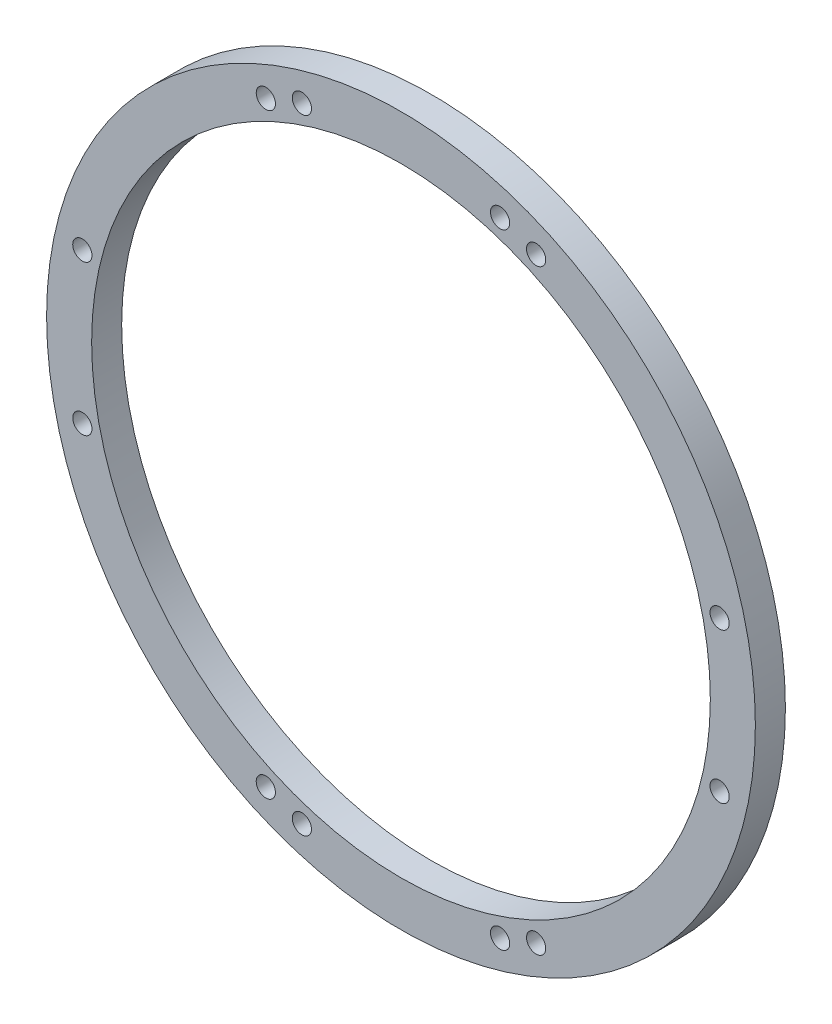
ISO-10303-21;
HEADER;
FILE_DESCRIPTION(('STEP AP214'),'2;1');
FILE_NAME('part.step','',(''),(''),'','','');
FILE_SCHEMA(('AUTOMOTIVE_DESIGN { 1 0 10303 214 1 1 1 1 }'));
ENDSEC;
DATA;
#1=APPLICATION_CONTEXT('core data for automotive mechanical design processes');
#2=APPLICATION_PROTOCOL_DEFINITION('international standard','automotive_design',2000,#1);
#3=PRODUCT_CONTEXT('',#1,'mechanical');
#4=PRODUCT('Part','Part','',(#3));
#5=PRODUCT_RELATED_PRODUCT_CATEGORY('part','',(#4));
#6=PRODUCT_DEFINITION_FORMATION('','',#4);
#7=PRODUCT_DEFINITION_CONTEXT('part definition',#1,'design');
#8=PRODUCT_DEFINITION('design','',#6,#7);
#9=PRODUCT_DEFINITION_SHAPE('','',#8);
#10=(LENGTH_UNIT() NAMED_UNIT(*) SI_UNIT(.MILLI.,.METRE.));
#11=(NAMED_UNIT(*) PLANE_ANGLE_UNIT() SI_UNIT($,.RADIAN.));
#12=(NAMED_UNIT(*) SI_UNIT($,.STERADIAN.) SOLID_ANGLE_UNIT());
#13=UNCERTAINTY_MEASURE_WITH_UNIT(LENGTH_MEASURE(1.E-05),#10,'distance_accuracy_value','');
#14=(GEOMETRIC_REPRESENTATION_CONTEXT(3) GLOBAL_UNCERTAINTY_ASSIGNED_CONTEXT((#13)) GLOBAL_UNIT_ASSIGNED_CONTEXT((#10,
#11,#12)) REPRESENTATION_CONTEXT('',''));
#15=CARTESIAN_POINT('',(0.,0.,0.));
#16=DIRECTION('',(0.,0.,1.));
#17=DIRECTION('',(1.,0.,0.));
#18=AXIS2_PLACEMENT_3D('',#15,#16,#17);
#19=CARTESIAN_POINT('',(0.,0.,5.));
#20=DIRECTION('',(0.,0.,1.));
#21=DIRECTION('',(1.,0.,0.));
#22=AXIS2_PLACEMENT_3D('',#19,#20,#21);
#23=PLANE('',#22);
#24=CARTESIAN_POINT('',(-22.5,49.6386945839634,5.));
#25=DIRECTION('',(0.,0.,1.));
#26=DIRECTION('',(-1.,0.,0.));
#27=AXIS2_PLACEMENT_3D('',#24,#25,#26);
#28=CIRCLE('',#27,1.6);
#29=CARTESIAN_POINT('',(-24.1,49.6386945839634,5.));
#30=VERTEX_POINT('',#29);
#31=EDGE_CURVE('E117',#30,#30,#28,.T.);
#32=ORIENTED_EDGE('',*,*,#31,.F.);
#33=EDGE_LOOP('',(#32));
#34=FACE_BOUND('',#33,.T.);
#35=CARTESIAN_POINT('',(-53.0471488394994,-12.5,5.));
#36=DIRECTION('',(0.,0.,1.));
#37=DIRECTION('',(1.,0.,0.));
#38=AXIS2_PLACEMENT_3D('',#35,#36,#37);
#39=CIRCLE('',#38,1.6);
#40=CARTESIAN_POINT('',(-51.4471488394994,-12.5,5.));
#41=VERTEX_POINT('',#40);
#42=EDGE_CURVE('E105',#41,#41,#39,.T.);
#43=ORIENTED_EDGE('',*,*,#42,.F.);
#44=EDGE_LOOP('',(#43));
#45=FACE_BOUND('',#44,.T.);
#46=CARTESIAN_POINT('',(-16.5,-51.9422756528822,5.));
#47=DIRECTION('',(0.,0.,1.));
#48=DIRECTION('',(1.,0.,0.));
#49=AXIS2_PLACEMENT_3D('',#46,#47,#48);
#50=CIRCLE('',#49,1.6);
#51=CARTESIAN_POINT('',(-14.9,-51.9422756528822,5.));
#52=VERTEX_POINT('',#51);
#53=EDGE_CURVE('E93',#52,#52,#50,.T.);
#54=ORIENTED_EDGE('',*,*,#53,.F.);
#55=EDGE_LOOP('',(#54));
#56=FACE_BOUND('',#55,.T.);
#57=CARTESIAN_POINT('',(16.5,-51.9422756528822,5.));
#58=DIRECTION('',(0.,0.,1.));
#59=DIRECTION('',(-1.,0.,0.));
#60=AXIS2_PLACEMENT_3D('',#57,#58,#59);
#61=CIRCLE('',#60,1.6);
#62=CARTESIAN_POINT('',(14.9,-51.9422756528822,5.));
#63=VERTEX_POINT('',#62);
#64=EDGE_CURVE('E81',#63,#63,#61,.T.);
#65=ORIENTED_EDGE('',*,*,#64,.F.);
#66=EDGE_LOOP('',(#65));
#67=FACE_BOUND('',#66,.T.);
#68=CARTESIAN_POINT('',(53.0471488394994,12.5,5.));
#69=DIRECTION('',(0.,0.,1.));
#70=DIRECTION('',(1.,0.,0.));
#71=AXIS2_PLACEMENT_3D('',#68,#69,#70);
#72=CIRCLE('',#71,1.6);
#73=CARTESIAN_POINT('',(54.6471488394994,12.5,5.));
#74=VERTEX_POINT('',#73);
#75=EDGE_CURVE('E69',#74,#74,#72,.T.);
#76=ORIENTED_EDGE('',*,*,#75,.F.);
#77=EDGE_LOOP('',(#76));
#78=FACE_BOUND('',#77,.T.);
#79=CARTESIAN_POINT('',(16.5,51.9422756528822,5.));
#80=DIRECTION('',(0.,0.,1.));
#81=DIRECTION('',(1.,0.,0.));
#82=AXIS2_PLACEMENT_3D('',#79,#80,#81);
#83=CIRCLE('',#82,1.6);
#84=CARTESIAN_POINT('',(18.1,51.9422756528822,5.));
#85=VERTEX_POINT('',#84);
#86=EDGE_CURVE('E57',#85,#85,#83,.T.);
#87=ORIENTED_EDGE('',*,*,#86,.F.);
#88=EDGE_LOOP('',(#87));
#89=FACE_BOUND('',#88,.T.);
#90=CARTESIAN_POINT('',(0.,0.,5.));
#91=DIRECTION('',(0.,0.,1.));
#92=DIRECTION('',(1.,0.,0.));
#93=AXIS2_PLACEMENT_3D('',#90,#91,#92);
#94=CIRCLE('',#93,59.);
#95=CARTESIAN_POINT('',(59.,0.,5.));
#96=VERTEX_POINT('',#95);
#97=EDGE_CURVE('E10',#96,#96,#94,.T.);
#98=ORIENTED_EDGE('',*,*,#97,.T.);
#99=EDGE_LOOP('',(#98));
#100=FACE_BOUND('',#99,.T.);
#101=CARTESIAN_POINT('',(0.,0.,5.));
#102=DIRECTION('',(0.,0.,1.));
#103=DIRECTION('',(1.,0.,0.));
#104=AXIS2_PLACEMENT_3D('',#101,#102,#103);
#105=CIRCLE('',#104,51.5);
#106=CARTESIAN_POINT('',(51.5,0.,5.));
#107=VERTEX_POINT('',#106);
#108=EDGE_CURVE('E52',#107,#107,#105,.T.);
#109=ORIENTED_EDGE('',*,*,#108,.F.);
#110=EDGE_LOOP('',(#109));
#111=FACE_BOUND('',#110,.T.);
#112=CARTESIAN_POINT('',(22.5,49.6386945839634,5.));
#113=DIRECTION('',(0.,0.,1.));
#114=DIRECTION('',(1.,0.,0.));
#115=AXIS2_PLACEMENT_3D('',#112,#113,#114);
#116=CIRCLE('',#115,1.6);
#117=CARTESIAN_POINT('',(24.1,49.6386945839634,5.));
#118=VERTEX_POINT('',#117);
#119=EDGE_CURVE('E63',#118,#118,#116,.T.);
#120=ORIENTED_EDGE('',*,*,#119,.F.);
#121=EDGE_LOOP('',(#120));
#122=FACE_BOUND('',#121,.T.);
#123=CARTESIAN_POINT('',(22.5,-49.6386945839634,5.));
#124=DIRECTION('',(0.,0.,1.));
#125=DIRECTION('',(-1.,0.,0.));
#126=AXIS2_PLACEMENT_3D('',#123,#124,#125);
#127=CIRCLE('',#126,1.6);
#128=CARTESIAN_POINT('',(20.9,-49.6386945839634,5.));
#129=VERTEX_POINT('',#128);
#130=EDGE_CURVE('E75',#129,#129,#127,.T.);
#131=ORIENTED_EDGE('',*,*,#130,.F.);
#132=EDGE_LOOP('',(#131));
#133=FACE_BOUND('',#132,.T.);
#134=CARTESIAN_POINT('',(53.0471488394994,-12.5,5.));
#135=DIRECTION('',(0.,0.,1.));
#136=DIRECTION('',(-1.,0.,0.));
#137=AXIS2_PLACEMENT_3D('',#134,#135,#136);
#138=CIRCLE('',#137,1.6);
#139=CARTESIAN_POINT('',(51.4471488394994,-12.5,5.));
#140=VERTEX_POINT('',#139);
#141=EDGE_CURVE('E87',#140,#140,#138,.T.);
#142=ORIENTED_EDGE('',*,*,#141,.F.);
#143=EDGE_LOOP('',(#142));
#144=FACE_BOUND('',#143,.T.);
#145=CARTESIAN_POINT('',(-22.5,-49.6386945839634,5.));
#146=DIRECTION('',(0.,0.,1.));
#147=DIRECTION('',(1.,0.,0.));
#148=AXIS2_PLACEMENT_3D('',#145,#146,#147);
#149=CIRCLE('',#148,1.6);
#150=CARTESIAN_POINT('',(-20.9,-49.6386945839634,5.));
#151=VERTEX_POINT('',#150);
#152=EDGE_CURVE('E99',#151,#151,#149,.T.);
#153=ORIENTED_EDGE('',*,*,#152,.F.);
#154=EDGE_LOOP('',(#153));
#155=FACE_BOUND('',#154,.T.);
#156=CARTESIAN_POINT('',(-53.0471488394994,12.5,5.));
#157=DIRECTION('',(0.,0.,1.));
#158=DIRECTION('',(-1.,0.,0.));
#159=AXIS2_PLACEMENT_3D('',#156,#157,#158);
#160=CIRCLE('',#159,1.6);
#161=CARTESIAN_POINT('',(-54.6471488394994,12.5,5.));
#162=VERTEX_POINT('',#161);
#163=EDGE_CURVE('E111',#162,#162,#160,.T.);
#164=ORIENTED_EDGE('',*,*,#163,.F.);
#165=EDGE_LOOP('',(#164));
#166=FACE_BOUND('',#165,.T.);
#167=CARTESIAN_POINT('',(-16.5,51.9422756528822,5.));
#168=DIRECTION('',(0.,0.,1.));
#169=DIRECTION('',(-1.,0.,0.));
#170=AXIS2_PLACEMENT_3D('',#167,#168,#169);
#171=CIRCLE('',#170,1.6);
#172=CARTESIAN_POINT('',(-18.1,51.9422756528822,5.));
#173=VERTEX_POINT('',#172);
#174=EDGE_CURVE('E123',#173,#173,#171,.T.);
#175=ORIENTED_EDGE('',*,*,#174,.F.);
#176=EDGE_LOOP('',(#175));
#177=FACE_BOUND('',#176,.T.);
#178=ADVANCED_FACE('F41',(#34,#45,#56,#67,#78,#89,#100,#111,#122,#133,#144,#155,#166,#177),#23,.T.);
#179=CARTESIAN_POINT('',(0.,0.,0.));
#180=DIRECTION('',(0.,0.,1.));
#181=DIRECTION('',(1.,0.,0.));
#182=AXIS2_PLACEMENT_3D('',#179,#180,#181);
#183=PLANE('',#182);
#184=CARTESIAN_POINT('',(0.,0.,0.));
#185=DIRECTION('',(0.,0.,1.));
#186=DIRECTION('',(1.,0.,0.));
#187=AXIS2_PLACEMENT_3D('',#184,#185,#186);
#188=CIRCLE('',#187,59.);
#189=CARTESIAN_POINT('',(59.,0.,0.));
#190=VERTEX_POINT('',#189);
#191=EDGE_CURVE('E45',#190,#190,#188,.T.);
#192=ORIENTED_EDGE('',*,*,#191,.F.);
#193=EDGE_LOOP('',(#192));
#194=FACE_BOUND('',#193,.T.);
#195=CARTESIAN_POINT('',(0.,0.,0.));
#196=DIRECTION('',(0.,0.,1.));
#197=DIRECTION('',(1.,0.,0.));
#198=AXIS2_PLACEMENT_3D('',#195,#196,#197);
#199=CIRCLE('',#198,51.5);
#200=CARTESIAN_POINT('',(51.5,0.,0.));
#201=VERTEX_POINT('',#200);
#202=EDGE_CURVE('E54',#201,#201,#199,.T.);
#203=ORIENTED_EDGE('',*,*,#202,.T.);
#204=EDGE_LOOP('',(#203));
#205=FACE_BOUND('',#204,.T.);
#206=CARTESIAN_POINT('',(16.5,51.9422756528822,0.));
#207=DIRECTION('',(0.,0.,1.));
#208=DIRECTION('',(1.,0.,0.));
#209=AXIS2_PLACEMENT_3D('',#206,#207,#208);
#210=CIRCLE('',#209,1.6);
#211=CARTESIAN_POINT('',(18.1,51.9422756528822,0.));
#212=VERTEX_POINT('',#211);
#213=EDGE_CURVE('E60',#212,#212,#210,.T.);
#214=ORIENTED_EDGE('',*,*,#213,.T.);
#215=EDGE_LOOP('',(#214));
#216=FACE_BOUND('',#215,.T.);
#217=CARTESIAN_POINT('',(22.5,49.6386945839634,0.));
#218=DIRECTION('',(0.,0.,1.));
#219=DIRECTION('',(1.,0.,0.));
#220=AXIS2_PLACEMENT_3D('',#217,#218,#219);
#221=CIRCLE('',#220,1.6);
#222=CARTESIAN_POINT('',(24.1,49.6386945839634,0.));
#223=VERTEX_POINT('',#222);
#224=EDGE_CURVE('E66',#223,#223,#221,.T.);
#225=ORIENTED_EDGE('',*,*,#224,.T.);
#226=EDGE_LOOP('',(#225));
#227=FACE_BOUND('',#226,.T.);
#228=CARTESIAN_POINT('',(53.0471488394994,12.5,0.));
#229=DIRECTION('',(0.,0.,1.));
#230=DIRECTION('',(1.,0.,0.));
#231=AXIS2_PLACEMENT_3D('',#228,#229,#230);
#232=CIRCLE('',#231,1.6);
#233=CARTESIAN_POINT('',(54.6471488394994,12.5,0.));
#234=VERTEX_POINT('',#233);
#235=EDGE_CURVE('E72',#234,#234,#232,.T.);
#236=ORIENTED_EDGE('',*,*,#235,.T.);
#237=EDGE_LOOP('',(#236));
#238=FACE_BOUND('',#237,.T.);
#239=CARTESIAN_POINT('',(22.5,-49.6386945839634,0.));
#240=DIRECTION('',(0.,0.,1.));
#241=DIRECTION('',(-1.,0.,0.));
#242=AXIS2_PLACEMENT_3D('',#239,#240,#241);
#243=CIRCLE('',#242,1.6);
#244=CARTESIAN_POINT('',(20.9,-49.6386945839634,0.));
#245=VERTEX_POINT('',#244);
#246=EDGE_CURVE('E78',#245,#245,#243,.T.);
#247=ORIENTED_EDGE('',*,*,#246,.T.);
#248=EDGE_LOOP('',(#247));
#249=FACE_BOUND('',#248,.T.);
#250=CARTESIAN_POINT('',(16.5,-51.9422756528822,0.));
#251=DIRECTION('',(0.,0.,1.));
#252=DIRECTION('',(-1.,0.,0.));
#253=AXIS2_PLACEMENT_3D('',#250,#251,#252);
#254=CIRCLE('',#253,1.6);
#255=CARTESIAN_POINT('',(14.9,-51.9422756528822,0.));
#256=VERTEX_POINT('',#255);
#257=EDGE_CURVE('E84',#256,#256,#254,.T.);
#258=ORIENTED_EDGE('',*,*,#257,.T.);
#259=EDGE_LOOP('',(#258));
#260=FACE_BOUND('',#259,.T.);
#261=CARTESIAN_POINT('',(53.0471488394994,-12.5,0.));
#262=DIRECTION('',(0.,0.,1.));
#263=DIRECTION('',(-1.,0.,0.));
#264=AXIS2_PLACEMENT_3D('',#261,#262,#263);
#265=CIRCLE('',#264,1.6);
#266=CARTESIAN_POINT('',(51.4471488394994,-12.5,0.));
#267=VERTEX_POINT('',#266);
#268=EDGE_CURVE('E90',#267,#267,#265,.T.);
#269=ORIENTED_EDGE('',*,*,#268,.T.);
#270=EDGE_LOOP('',(#269));
#271=FACE_BOUND('',#270,.T.);
#272=CARTESIAN_POINT('',(-16.5,-51.9422756528822,0.));
#273=DIRECTION('',(0.,0.,1.));
#274=DIRECTION('',(1.,0.,0.));
#275=AXIS2_PLACEMENT_3D('',#272,#273,#274);
#276=CIRCLE('',#275,1.6);
#277=CARTESIAN_POINT('',(-14.9,-51.9422756528822,0.));
#278=VERTEX_POINT('',#277);
#279=EDGE_CURVE('E96',#278,#278,#276,.T.);
#280=ORIENTED_EDGE('',*,*,#279,.T.);
#281=EDGE_LOOP('',(#280));
#282=FACE_BOUND('',#281,.T.);
#283=CARTESIAN_POINT('',(-22.5,-49.6386945839634,0.));
#284=DIRECTION('',(0.,0.,1.));
#285=DIRECTION('',(1.,0.,0.));
#286=AXIS2_PLACEMENT_3D('',#283,#284,#285);
#287=CIRCLE('',#286,1.6);
#288=CARTESIAN_POINT('',(-20.9,-49.6386945839634,0.));
#289=VERTEX_POINT('',#288);
#290=EDGE_CURVE('E102',#289,#289,#287,.T.);
#291=ORIENTED_EDGE('',*,*,#290,.T.);
#292=EDGE_LOOP('',(#291));
#293=FACE_BOUND('',#292,.T.);
#294=CARTESIAN_POINT('',(-53.0471488394994,-12.5,0.));
#295=DIRECTION('',(0.,0.,1.));
#296=DIRECTION('',(1.,0.,0.));
#297=AXIS2_PLACEMENT_3D('',#294,#295,#296);
#298=CIRCLE('',#297,1.6);
#299=CARTESIAN_POINT('',(-51.4471488394994,-12.5,0.));
#300=VERTEX_POINT('',#299);
#301=EDGE_CURVE('E108',#300,#300,#298,.T.);
#302=ORIENTED_EDGE('',*,*,#301,.T.);
#303=EDGE_LOOP('',(#302));
#304=FACE_BOUND('',#303,.T.);
#305=CARTESIAN_POINT('',(-53.0471488394994,12.5,0.));
#306=DIRECTION('',(0.,0.,1.));
#307=DIRECTION('',(-1.,0.,0.));
#308=AXIS2_PLACEMENT_3D('',#305,#306,#307);
#309=CIRCLE('',#308,1.6);
#310=CARTESIAN_POINT('',(-54.6471488394994,12.5,0.));
#311=VERTEX_POINT('',#310);
#312=EDGE_CURVE('E114',#311,#311,#309,.T.);
#313=ORIENTED_EDGE('',*,*,#312,.T.);
#314=EDGE_LOOP('',(#313));
#315=FACE_BOUND('',#314,.T.);
#316=CARTESIAN_POINT('',(-22.5,49.6386945839634,0.));
#317=DIRECTION('',(0.,0.,1.));
#318=DIRECTION('',(-1.,0.,0.));
#319=AXIS2_PLACEMENT_3D('',#316,#317,#318);
#320=CIRCLE('',#319,1.6);
#321=CARTESIAN_POINT('',(-24.1,49.6386945839634,0.));
#322=VERTEX_POINT('',#321);
#323=EDGE_CURVE('E120',#322,#322,#320,.T.);
#324=ORIENTED_EDGE('',*,*,#323,.T.);
#325=EDGE_LOOP('',(#324));
#326=FACE_BOUND('',#325,.T.);
#327=CARTESIAN_POINT('',(-16.5,51.9422756528822,0.));
#328=DIRECTION('',(0.,0.,1.));
#329=DIRECTION('',(-1.,0.,0.));
#330=AXIS2_PLACEMENT_3D('',#327,#328,#329);
#331=CIRCLE('',#330,1.6);
#332=CARTESIAN_POINT('',(-18.1,51.9422756528822,0.));
#333=VERTEX_POINT('',#332);
#334=EDGE_CURVE('E126',#333,#333,#331,.T.);
#335=ORIENTED_EDGE('',*,*,#334,.T.);
#336=EDGE_LOOP('',(#335));
#337=FACE_BOUND('',#336,.T.);
#338=ADVANCED_FACE('F136',(#194,#205,#216,#227,#238,#249,#260,#271,#282,#293,#304,#315,#326,
#337),#183,.F.);
#339=CARTESIAN_POINT('',(0.,0.,5.));
#340=DIRECTION('',(0.,0.,-1.));
#341=DIRECTION('',(-1.,0.,0.));
#342=AXIS2_PLACEMENT_3D('',#339,#340,#341);
#343=CYLINDRICAL_SURFACE('',#342,59.);
#344=ORIENTED_EDGE('',*,*,#97,.F.);
#345=EDGE_LOOP('',(#344));
#346=FACE_BOUND('',#345,.T.);
#347=ORIENTED_EDGE('',*,*,#191,.T.);
#348=EDGE_LOOP('',(#347));
#349=FACE_BOUND('',#348,.T.);
#350=ADVANCED_FACE('F43',(#346,#349),#343,.T.);
#351=CARTESIAN_POINT('',(0.,0.,5.));
#352=DIRECTION('',(0.,0.,-1.));
#353=DIRECTION('',(-1.,0.,0.));
#354=AXIS2_PLACEMENT_3D('',#351,#352,#353);
#355=CYLINDRICAL_SURFACE('',#354,51.5);
#356=ORIENTED_EDGE('',*,*,#108,.T.);
#357=EDGE_LOOP('',(#356));
#358=FACE_BOUND('',#357,.T.);
#359=ORIENTED_EDGE('',*,*,#202,.F.);
#360=EDGE_LOOP('',(#359));
#361=FACE_BOUND('',#360,.T.);
#362=ADVANCED_FACE('F146',(#358,#361),#355,.F.);
#363=CARTESIAN_POINT('',(16.5,51.9422756528822,5.));
#364=DIRECTION('',(0.,0.,-1.));
#365=DIRECTION('',(-1.,0.,0.));
#366=AXIS2_PLACEMENT_3D('',#363,#364,#365);
#367=CYLINDRICAL_SURFACE('',#366,1.6);
#368=ORIENTED_EDGE('',*,*,#86,.T.);
#369=EDGE_LOOP('',(#368));
#370=FACE_BOUND('',#369,.T.);
#371=ORIENTED_EDGE('',*,*,#213,.F.);
#372=EDGE_LOOP('',(#371));
#373=FACE_BOUND('',#372,.T.);
#374=ADVANCED_FACE('F149',(#370,#373),#367,.F.);
#375=CARTESIAN_POINT('',(22.5,49.6386945839634,5.));
#376=DIRECTION('',(0.,0.,-1.));
#377=DIRECTION('',(-1.,0.,0.));
#378=AXIS2_PLACEMENT_3D('',#375,#376,#377);
#379=CYLINDRICAL_SURFACE('',#378,1.6);
#380=ORIENTED_EDGE('',*,*,#119,.T.);
#381=EDGE_LOOP('',(#380));
#382=FACE_BOUND('',#381,.T.);
#383=ORIENTED_EDGE('',*,*,#224,.F.);
#384=EDGE_LOOP('',(#383));
#385=FACE_BOUND('',#384,.T.);
#386=ADVANCED_FACE('F153',(#382,#385),#379,.F.);
#387=CARTESIAN_POINT('',(53.0471488394994,12.5,5.));
#388=DIRECTION('',(0.,0.,-1.));
#389=DIRECTION('',(-1.,0.,0.));
#390=AXIS2_PLACEMENT_3D('',#387,#388,#389);
#391=CYLINDRICAL_SURFACE('',#390,1.6);
#392=ORIENTED_EDGE('',*,*,#75,.T.);
#393=EDGE_LOOP('',(#392));
#394=FACE_BOUND('',#393,.T.);
#395=ORIENTED_EDGE('',*,*,#235,.F.);
#396=EDGE_LOOP('',(#395));
#397=FACE_BOUND('',#396,.T.);
#398=ADVANCED_FACE('F157',(#394,#397),#391,.F.);
#399=CARTESIAN_POINT('',(22.5,-49.6386945839634,5.));
#400=DIRECTION('',(0.,0.,-1.));
#401=DIRECTION('',(-1.,0.,0.));
#402=AXIS2_PLACEMENT_3D('',#399,#400,#401);
#403=CYLINDRICAL_SURFACE('',#402,1.6);
#404=ORIENTED_EDGE('',*,*,#130,.T.);
#405=EDGE_LOOP('',(#404));
#406=FACE_BOUND('',#405,.T.);
#407=ORIENTED_EDGE('',*,*,#246,.F.);
#408=EDGE_LOOP('',(#407));
#409=FACE_BOUND('',#408,.T.);
#410=ADVANCED_FACE('F161',(#406,#409),#403,.F.);
#411=CARTESIAN_POINT('',(16.5,-51.9422756528822,5.));
#412=DIRECTION('',(0.,0.,-1.));
#413=DIRECTION('',(-1.,0.,0.));
#414=AXIS2_PLACEMENT_3D('',#411,#412,#413);
#415=CYLINDRICAL_SURFACE('',#414,1.6);
#416=ORIENTED_EDGE('',*,*,#64,.T.);
#417=EDGE_LOOP('',(#416));
#418=FACE_BOUND('',#417,.T.);
#419=ORIENTED_EDGE('',*,*,#257,.F.);
#420=EDGE_LOOP('',(#419));
#421=FACE_BOUND('',#420,.T.);
#422=ADVANCED_FACE('F165',(#418,#421),#415,.F.);
#423=CARTESIAN_POINT('',(53.0471488394994,-12.5,5.));
#424=DIRECTION('',(0.,0.,-1.));
#425=DIRECTION('',(-1.,0.,0.));
#426=AXIS2_PLACEMENT_3D('',#423,#424,#425);
#427=CYLINDRICAL_SURFACE('',#426,1.6);
#428=ORIENTED_EDGE('',*,*,#141,.T.);
#429=EDGE_LOOP('',(#428));
#430=FACE_BOUND('',#429,.T.);
#431=ORIENTED_EDGE('',*,*,#268,.F.);
#432=EDGE_LOOP('',(#431));
#433=FACE_BOUND('',#432,.T.);
#434=ADVANCED_FACE('F169',(#430,#433),#427,.F.);
#435=CARTESIAN_POINT('',(-16.5,-51.9422756528822,5.));
#436=DIRECTION('',(0.,0.,-1.));
#437=DIRECTION('',(-1.,0.,0.));
#438=AXIS2_PLACEMENT_3D('',#435,#436,#437);
#439=CYLINDRICAL_SURFACE('',#438,1.6);
#440=ORIENTED_EDGE('',*,*,#53,.T.);
#441=EDGE_LOOP('',(#440));
#442=FACE_BOUND('',#441,.T.);
#443=ORIENTED_EDGE('',*,*,#279,.F.);
#444=EDGE_LOOP('',(#443));
#445=FACE_BOUND('',#444,.T.);
#446=ADVANCED_FACE('F173',(#442,#445),#439,.F.);
#447=CARTESIAN_POINT('',(-22.5,-49.6386945839634,5.));
#448=DIRECTION('',(0.,0.,-1.));
#449=DIRECTION('',(-1.,0.,0.));
#450=AXIS2_PLACEMENT_3D('',#447,#448,#449);
#451=CYLINDRICAL_SURFACE('',#450,1.6);
#452=ORIENTED_EDGE('',*,*,#152,.T.);
#453=EDGE_LOOP('',(#452));
#454=FACE_BOUND('',#453,.T.);
#455=ORIENTED_EDGE('',*,*,#290,.F.);
#456=EDGE_LOOP('',(#455));
#457=FACE_BOUND('',#456,.T.);
#458=ADVANCED_FACE('F177',(#454,#457),#451,.F.);
#459=CARTESIAN_POINT('',(-53.0471488394994,-12.5,5.));
#460=DIRECTION('',(0.,0.,-1.));
#461=DIRECTION('',(-1.,0.,0.));
#462=AXIS2_PLACEMENT_3D('',#459,#460,#461);
#463=CYLINDRICAL_SURFACE('',#462,1.6);
#464=ORIENTED_EDGE('',*,*,#42,.T.);
#465=EDGE_LOOP('',(#464));
#466=FACE_BOUND('',#465,.T.);
#467=ORIENTED_EDGE('',*,*,#301,.F.);
#468=EDGE_LOOP('',(#467));
#469=FACE_BOUND('',#468,.T.);
#470=ADVANCED_FACE('F181',(#466,#469),#463,.F.);
#471=CARTESIAN_POINT('',(-53.0471488394994,12.5,5.));
#472=DIRECTION('',(0.,0.,-1.));
#473=DIRECTION('',(-1.,0.,0.));
#474=AXIS2_PLACEMENT_3D('',#471,#472,#473);
#475=CYLINDRICAL_SURFACE('',#474,1.6);
#476=ORIENTED_EDGE('',*,*,#163,.T.);
#477=EDGE_LOOP('',(#476));
#478=FACE_BOUND('',#477,.T.);
#479=ORIENTED_EDGE('',*,*,#312,.F.);
#480=EDGE_LOOP('',(#479));
#481=FACE_BOUND('',#480,.T.);
#482=ADVANCED_FACE('F185',(#478,#481),#475,.F.);
#483=CARTESIAN_POINT('',(-22.5,49.6386945839634,5.));
#484=DIRECTION('',(0.,0.,-1.));
#485=DIRECTION('',(-1.,0.,0.));
#486=AXIS2_PLACEMENT_3D('',#483,#484,#485);
#487=CYLINDRICAL_SURFACE('',#486,1.6);
#488=ORIENTED_EDGE('',*,*,#31,.T.);
#489=EDGE_LOOP('',(#488));
#490=FACE_BOUND('',#489,.T.);
#491=ORIENTED_EDGE('',*,*,#323,.F.);
#492=EDGE_LOOP('',(#491));
#493=FACE_BOUND('',#492,.T.);
#494=ADVANCED_FACE('F189',(#490,#493),#487,.F.);
#495=CARTESIAN_POINT('',(-16.5,51.9422756528822,5.));
#496=DIRECTION('',(0.,0.,-1.));
#497=DIRECTION('',(-1.,0.,0.));
#498=AXIS2_PLACEMENT_3D('',#495,#496,#497);
#499=CYLINDRICAL_SURFACE('',#498,1.6);
#500=ORIENTED_EDGE('',*,*,#174,.T.);
#501=EDGE_LOOP('',(#500));
#502=FACE_BOUND('',#501,.T.);
#503=ORIENTED_EDGE('',*,*,#334,.F.);
#504=EDGE_LOOP('',(#503));
#505=FACE_BOUND('',#504,.T.);
#506=ADVANCED_FACE('F132',(#502,#505),#499,.F.);
#507=CLOSED_SHELL('',(#178,#338,#350,#362,#374,#386,#398,#410,#422,#434,#446,#458,#470,#482,
#494,#506));
#508=MANIFOLD_SOLID_BREP('B2',#507);
#509=ADVANCED_BREP_SHAPE_REPRESENTATION('',(#18,#508),#14);
#510=SHAPE_DEFINITION_REPRESENTATION(#9,#509);
ENDSEC;
END-ISO-10303-21;
